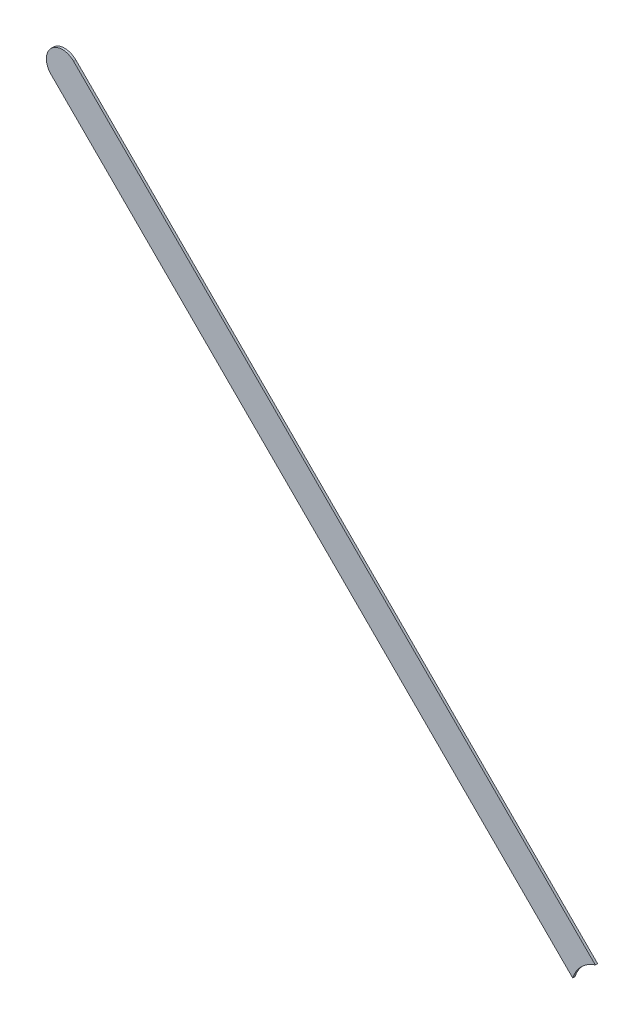
ISO-10303-21;
HEADER;
FILE_DESCRIPTION(('STEP AP214'),'2;1');
FILE_NAME('part.step','',(''),(''),'','','');
FILE_SCHEMA(('AUTOMOTIVE_DESIGN { 1 0 10303 214 1 1 1 1 }'));
ENDSEC;
DATA;
#1=APPLICATION_CONTEXT('core data for automotive mechanical design processes');
#2=APPLICATION_PROTOCOL_DEFINITION('international standard','automotive_design',2000,#1);
#3=PRODUCT_CONTEXT('',#1,'mechanical');
#4=PRODUCT('Part','Part','',(#3));
#5=PRODUCT_RELATED_PRODUCT_CATEGORY('part','',(#4));
#6=PRODUCT_DEFINITION_FORMATION('','',#4);
#7=PRODUCT_DEFINITION_CONTEXT('part definition',#1,'design');
#8=PRODUCT_DEFINITION('design','',#6,#7);
#9=PRODUCT_DEFINITION_SHAPE('','',#8);
#10=(LENGTH_UNIT() NAMED_UNIT(*) SI_UNIT(.MILLI.,.METRE.));
#11=(NAMED_UNIT(*) PLANE_ANGLE_UNIT() SI_UNIT($,.RADIAN.));
#12=(NAMED_UNIT(*) SI_UNIT($,.STERADIAN.) SOLID_ANGLE_UNIT());
#13=UNCERTAINTY_MEASURE_WITH_UNIT(LENGTH_MEASURE(1.E-05),#10,'distance_accuracy_value','');
#14=(GEOMETRIC_REPRESENTATION_CONTEXT(3) GLOBAL_UNCERTAINTY_ASSIGNED_CONTEXT((#13)) GLOBAL_UNIT_ASSIGNED_CONTEXT((#10,
#11,#12)) REPRESENTATION_CONTEXT('',''));
#15=CARTESIAN_POINT('',(0.,0.,0.));
#16=DIRECTION('',(0.,0.,1.));
#17=DIRECTION('',(1.,0.,0.));
#18=AXIS2_PLACEMENT_3D('',#15,#16,#17);
#19=CARTESIAN_POINT('',(70.22322252,61.21650698,0.));
#20=DIRECTION('',(0.707106781186547,0.707106781186548,0.));
#21=DIRECTION('',(0.707106781186548,-0.707106781186547,0.));
#22=AXIS2_PLACEMENT_3D('',#19,#20,#21);
#23=PLANE('',#22);
#24=DIRECTION('',(0.707106781186548,-0.707106781186547,0.));
#25=VECTOR('',#24,1.);
#26=CARTESIAN_POINT('',(70.22322252,61.21650698,0.03556));
#27=LINE('',#26,#25);
#28=CARTESIAN_POINT('',(70.22322252,61.21650698,0.03556));
#29=VERTEX_POINT('',#28);
#30=CARTESIAN_POINT('',(78.3768335489267,53.0628959510733,0.03556));
#31=VERTEX_POINT('',#30);
#32=EDGE_CURVE('E11',#29,#31,#27,.T.);
#33=ORIENTED_EDGE('',*,*,#32,.F.);
#34=DIRECTION('',(0.,0.,1.));
#35=VECTOR('',#34,1.);
#36=CARTESIAN_POINT('',(70.22322252,61.21650698,0.));
#37=LINE('',#36,#35);
#38=CARTESIAN_POINT('',(70.22322252,61.21650698,0.));
#39=VERTEX_POINT('',#38);
#40=EDGE_CURVE('E24',#39,#29,#37,.T.);
#41=ORIENTED_EDGE('',*,*,#40,.F.);
#42=DIRECTION('',(0.707106781186548,-0.707106781186547,0.));
#43=VECTOR('',#42,1.);
#44=CARTESIAN_POINT('',(70.22322252,61.21650698,0.));
#45=LINE('',#44,#43);
#46=CARTESIAN_POINT('',(78.3768335489267,53.0628959510733,0.));
#47=VERTEX_POINT('',#46);
#48=EDGE_CURVE('E75',#39,#47,#45,.T.);
#49=ORIENTED_EDGE('',*,*,#48,.T.);
#50=DIRECTION('',(0.,0.,1.));
#51=VECTOR('',#50,1.);
#52=CARTESIAN_POINT('',(78.3768335489267,53.0628959510733,0.));
#53=LINE('',#52,#51);
#54=EDGE_CURVE('E37',#47,#31,#53,.T.);
#55=ORIENTED_EDGE('',*,*,#54,.T.);
#56=EDGE_LOOP('',(#33,#41,#49,#55));
#57=FACE_BOUND('',#56,.T.);
#58=ADVANCED_FACE('F17',(#57),#23,.F.);
#59=CARTESIAN_POINT('',(78.90002,52.8932648,0.));
#60=DIRECTION('',(0.,0.,-1.));
#61=DIRECTION('',(1.,0.,0.));
#62=AXIS2_PLACEMENT_3D('',#59,#60,#61);
#63=CYLINDRICAL_SURFACE('',#62,0.5499989);
#64=DIRECTION('',(0.,0.,1.));
#65=VECTOR('',#64,1.);
#66=CARTESIAN_POINT('',(78.730385012738,53.416450007262,0.));
#67=LINE('',#66,#65);
#68=CARTESIAN_POINT('',(78.730385012738,53.416450007262,0.));
#69=VERTEX_POINT('',#68);
#70=CARTESIAN_POINT('',(78.730385012738,53.416450007262,0.03556));
#71=VERTEX_POINT('',#70);
#72=EDGE_CURVE('E67',#69,#71,#67,.T.);
#73=ORIENTED_EDGE('',*,*,#72,.T.);
#74=CARTESIAN_POINT('',(78.90002,52.8932648,0.03556));
#75=DIRECTION('',(0.,0.,1.));
#76=DIRECTION('',(1.,0.,0.));
#77=AXIS2_PLACEMENT_3D('',#74,#75,#76);
#78=CIRCLE('',#77,0.5499989);
#79=EDGE_CURVE('E82',#71,#31,#78,.T.);
#80=ORIENTED_EDGE('',*,*,#79,.T.);
#81=ORIENTED_EDGE('',*,*,#54,.F.);
#82=CARTESIAN_POINT('',(78.90002,52.8932648,0.));
#83=DIRECTION('',(0.,0.,1.));
#84=DIRECTION('',(1.,0.,0.));
#85=AXIS2_PLACEMENT_3D('',#82,#83,#84);
#86=CIRCLE('',#85,0.5499989);
#87=EDGE_CURVE('E80',#69,#47,#86,.T.);
#88=ORIENTED_EDGE('',*,*,#87,.F.);
#89=EDGE_LOOP('',(#73,#80,#81,#88));
#90=FACE_BOUND('',#89,.T.);
#91=ADVANCED_FACE('F88',(#90),#63,.F.);
#92=CARTESIAN_POINT('',(78.730385012738,53.416450007262,0.));
#93=DIRECTION('',(-0.707106781186548,-0.707106781186547,0.));
#94=DIRECTION('',(-0.707106781186547,0.707106781186548,0.));
#95=AXIS2_PLACEMENT_3D('',#92,#93,#94);
#96=PLANE('',#95);
#97=DIRECTION('',(-0.707106781186547,0.707106781186548,0.));
#98=VECTOR('',#97,1.);
#99=CARTESIAN_POINT('',(79.07679384,53.07004118,0.03556));
#100=LINE('',#99,#98);
#101=CARTESIAN_POINT('',(70.57677528,61.57005974,0.03556));
#102=VERTEX_POINT('',#101);
#103=EDGE_CURVE('E71',#71,#102,#100,.T.);
#104=ORIENTED_EDGE('',*,*,#103,.F.);
#105=ORIENTED_EDGE('',*,*,#72,.F.);
#106=DIRECTION('',(-0.707106781186547,0.707106781186548,0.));
#107=VECTOR('',#106,1.);
#108=CARTESIAN_POINT('',(79.07679384,53.07004118,0.));
#109=LINE('',#108,#107);
#110=CARTESIAN_POINT('',(70.57677528,61.57005974,0.));
#111=VERTEX_POINT('',#110);
#112=EDGE_CURVE('E63',#69,#111,#109,.T.);
#113=ORIENTED_EDGE('',*,*,#112,.T.);
#114=DIRECTION('',(0.,0.,1.));
#115=VECTOR('',#114,1.);
#116=CARTESIAN_POINT('',(70.57677528,61.57005974,0.));
#117=LINE('',#116,#115);
#118=EDGE_CURVE('E53',#111,#102,#117,.T.);
#119=ORIENTED_EDGE('',*,*,#118,.T.);
#120=EDGE_LOOP('',(#104,#105,#113,#119));
#121=FACE_BOUND('',#120,.T.);
#122=ADVANCED_FACE('F66',(#121),#96,.F.);
#123=CARTESIAN_POINT('',(70.3999989,61.39328336,0.));
#124=DIRECTION('',(0.,0.,-1.));
#125=DIRECTION('',(0.707106781186562,0.707106781186533,0.));
#126=AXIS2_PLACEMENT_3D('',#123,#124,#125);
#127=CYLINDRICAL_SURFACE('',#126,0.249999554103226);
#128=CARTESIAN_POINT('',(70.3999989,61.39328336,0.03556));
#129=DIRECTION('',(0.,0.,1.));
#130=DIRECTION('',(0.707106781186562,0.707106781186533,0.));
#131=AXIS2_PLACEMENT_3D('',#128,#129,#130);
#132=CIRCLE('',#131,0.249999554103226);
#133=EDGE_CURVE('E59',#102,#29,#132,.T.);
#134=ORIENTED_EDGE('',*,*,#133,.F.);
#135=ORIENTED_EDGE('',*,*,#118,.F.);
#136=CARTESIAN_POINT('',(70.3999989,61.39328336,0.));
#137=DIRECTION('',(0.,0.,1.));
#138=DIRECTION('',(0.707106781186562,0.707106781186533,0.));
#139=AXIS2_PLACEMENT_3D('',#136,#137,#138);
#140=CIRCLE('',#139,0.249999554103226);
#141=EDGE_CURVE('E57',#111,#39,#140,.T.);
#142=ORIENTED_EDGE('',*,*,#141,.T.);
#143=ORIENTED_EDGE('',*,*,#40,.T.);
#144=EDGE_LOOP('',(#134,#135,#142,#143));
#145=FACE_BOUND('',#144,.T.);
#146=ADVANCED_FACE('F55',(#145),#127,.T.);
#147=CARTESIAN_POINT('',(70.22322252,61.21650698,0.));
#148=DIRECTION('',(0.,0.,-1.));
#149=DIRECTION('',(-1.,0.,0.));
#150=AXIS2_PLACEMENT_3D('',#147,#148,#149);
#151=PLANE('',#150);
#152=ORIENTED_EDGE('',*,*,#48,.F.);
#153=ORIENTED_EDGE('',*,*,#141,.F.);
#154=ORIENTED_EDGE('',*,*,#112,.F.);
#155=ORIENTED_EDGE('',*,*,#87,.T.);
#156=EDGE_LOOP('',(#152,#153,#154,#155));
#157=FACE_BOUND('',#156,.T.);
#158=ADVANCED_FACE('F74',(#157),#151,.T.);
#159=CARTESIAN_POINT('',(70.22322252,61.21650698,0.03556));
#160=DIRECTION('',(0.,0.,-1.));
#161=DIRECTION('',(-1.,0.,0.));
#162=AXIS2_PLACEMENT_3D('',#159,#160,#161);
#163=PLANE('',#162);
#164=ORIENTED_EDGE('',*,*,#133,.T.);
#165=ORIENTED_EDGE('',*,*,#32,.T.);
#166=ORIENTED_EDGE('',*,*,#79,.F.);
#167=ORIENTED_EDGE('',*,*,#103,.T.);
#168=EDGE_LOOP('',(#164,#165,#166,#167));
#169=FACE_BOUND('',#168,.T.);
#170=ADVANCED_FACE('F91',(#169),#163,.F.);
#171=CLOSED_SHELL('',(#58,#91,#122,#146,#158,#170));
#172=MANIFOLD_SOLID_BREP('B1',#171);
#173=ADVANCED_BREP_SHAPE_REPRESENTATION('',(#18,#172),#14);
#174=SHAPE_DEFINITION_REPRESENTATION(#9,#173);
ENDSEC;
END-ISO-10303-21;
